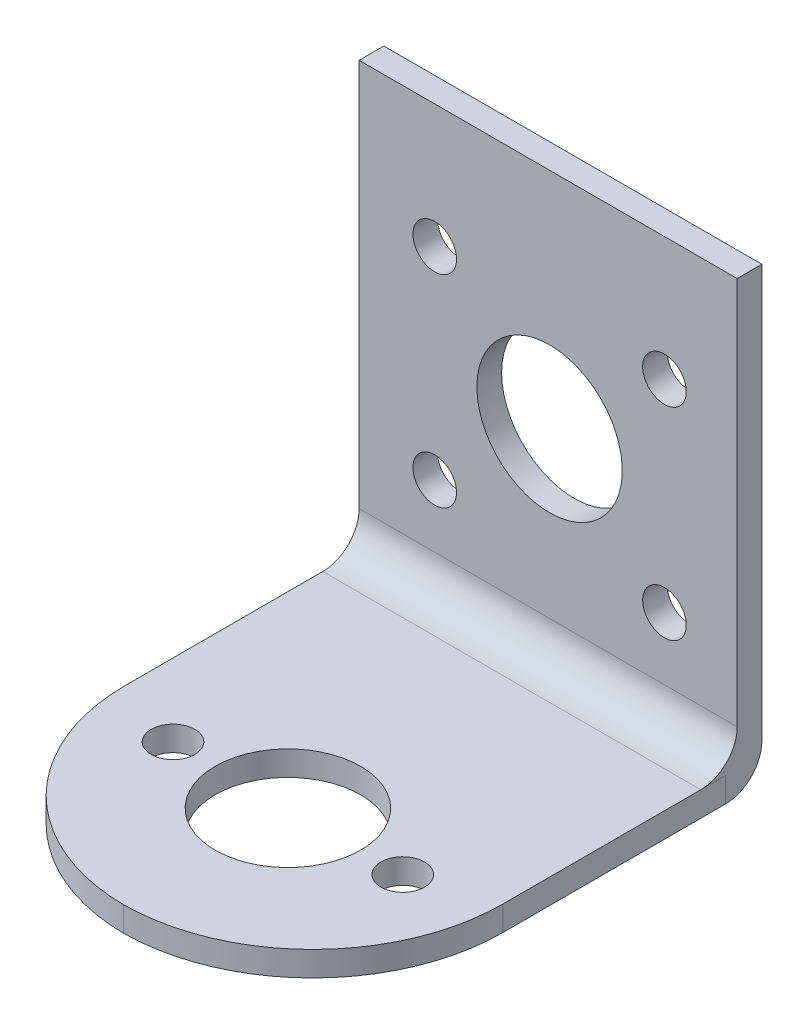
ISO-10303-21;
HEADER;
FILE_DESCRIPTION(('STEP AP214'),'2;1');
FILE_NAME('part.step','',(''),(''),'','','');
FILE_SCHEMA(('AUTOMOTIVE_DESIGN { 1 0 10303 214 1 1 1 1 }'));
ENDSEC;
DATA;
#1=APPLICATION_CONTEXT('core data for automotive mechanical design processes');
#2=APPLICATION_PROTOCOL_DEFINITION('international standard','automotive_design',2000,#1);
#3=PRODUCT_CONTEXT('',#1,'mechanical');
#4=PRODUCT('Part','Part','',(#3));
#5=PRODUCT_RELATED_PRODUCT_CATEGORY('part','',(#4));
#6=PRODUCT_DEFINITION_FORMATION('','',#4);
#7=PRODUCT_DEFINITION_CONTEXT('part definition',#1,'design');
#8=PRODUCT_DEFINITION('design','',#6,#7);
#9=PRODUCT_DEFINITION_SHAPE('','',#8);
#10=(LENGTH_UNIT() NAMED_UNIT(*) SI_UNIT(.MILLI.,.METRE.));
#11=(NAMED_UNIT(*) PLANE_ANGLE_UNIT() SI_UNIT($,.RADIAN.));
#12=(NAMED_UNIT(*) SI_UNIT($,.STERADIAN.) SOLID_ANGLE_UNIT());
#13=UNCERTAINTY_MEASURE_WITH_UNIT(LENGTH_MEASURE(1.E-05),#10,'distance_accuracy_value','');
#14=(GEOMETRIC_REPRESENTATION_CONTEXT(3) GLOBAL_UNCERTAINTY_ASSIGNED_CONTEXT((#13)) GLOBAL_UNIT_ASSIGNED_CONTEXT((#10,
#11,#12)) REPRESENTATION_CONTEXT('',''));
#15=CARTESIAN_POINT('',(0.,0.,0.));
#16=DIRECTION('',(0.,0.,1.));
#17=DIRECTION('',(1.,0.,0.));
#18=AXIS2_PLACEMENT_3D('',#15,#16,#17);
#19=CARTESIAN_POINT('',(0.,0.,0.));
#20=DIRECTION('',(0.,0.,1.));
#21=DIRECTION('',(1.,0.,0.));
#22=AXIS2_PLACEMENT_3D('',#19,#20,#21);
#23=PLANE('',#22);
#24=CARTESIAN_POINT('',(8.,6.95,0.));
#25=DIRECTION('',(0.,0.,-1.));
#26=DIRECTION('',(1.,0.,0.));
#27=AXIS2_PLACEMENT_3D('',#24,#25,#26);
#28=CIRCLE('',#27,1.5);
#29=CARTESIAN_POINT('',(6.5,6.95,0.));
#30=VERTEX_POINT('',#29);
#31=EDGE_CURVE('E213',#30,#30,#28,.T.);
#32=ORIENTED_EDGE('',*,*,#31,.F.);
#33=EDGE_LOOP('',(#32));
#34=FACE_BOUND('',#33,.T.);
#35=CARTESIAN_POINT('',(-7.8,-6.95,0.));
#36=DIRECTION('',(0.,0.,-1.));
#37=DIRECTION('',(1.,0.,0.));
#38=AXIS2_PLACEMENT_3D('',#35,#36,#37);
#39=CIRCLE('',#38,1.5);
#40=CARTESIAN_POINT('',(-9.3,-6.95,0.));
#41=VERTEX_POINT('',#40);
#42=EDGE_CURVE('E179',#41,#41,#39,.T.);
#43=ORIENTED_EDGE('',*,*,#42,.F.);
#44=EDGE_LOOP('',(#43));
#45=FACE_BOUND('',#44,.T.);
#46=CARTESIAN_POINT('',(8.,-6.95,0.));
#47=DIRECTION('',(0.,0.,-1.));
#48=DIRECTION('',(1.,0.,0.));
#49=AXIS2_PLACEMENT_3D('',#46,#47,#48);
#50=CIRCLE('',#49,1.5);
#51=CARTESIAN_POINT('',(6.5,-6.95,0.));
#52=VERTEX_POINT('',#51);
#53=EDGE_CURVE('E185',#52,#52,#50,.T.);
#54=ORIENTED_EDGE('',*,*,#53,.F.);
#55=EDGE_LOOP('',(#54));
#56=FACE_BOUND('',#55,.T.);
#57=CARTESIAN_POINT('',(0.1,0.0500000000000012,0.));
#58=DIRECTION('',(0.,0.,-1.));
#59=DIRECTION('',(1.,0.,0.));
#60=AXIS2_PLACEMENT_3D('',#57,#58,#59);
#61=CIRCLE('',#60,5.);
#62=CARTESIAN_POINT('',(-4.9,0.0500000000000006,0.));
#63=VERTEX_POINT('',#62);
#64=EDGE_CURVE('E199',#63,#63,#61,.T.);
#65=ORIENTED_EDGE('',*,*,#64,.F.);
#66=EDGE_LOOP('',(#65));
#67=FACE_BOUND('',#66,.T.);
#68=CARTESIAN_POINT('',(-7.8,6.95,0.));
#69=DIRECTION('',(0.,0.,-1.));
#70=DIRECTION('',(1.,0.,0.));
#71=AXIS2_PLACEMENT_3D('',#68,#69,#70);
#72=CIRCLE('',#71,1.5);
#73=CARTESIAN_POINT('',(-9.3,6.95,0.));
#74=VERTEX_POINT('',#73);
#75=EDGE_CURVE('E27',#74,#74,#72,.T.);
#76=ORIENTED_EDGE('',*,*,#75,.F.);
#77=EDGE_LOOP('',(#76));
#78=FACE_BOUND('',#77,.T.);
#79=DIRECTION('',(1.,0.,0.));
#80=VECTOR('',#79,1.);
#81=CARTESIAN_POINT('',(-6.5,-12.95,0.));
#82=LINE('',#81,#80);
#83=CARTESIAN_POINT('',(-13.,-12.95,0.));
#84=VERTEX_POINT('',#83);
#85=CARTESIAN_POINT('',(13.,-12.95,0.));
#86=VERTEX_POINT('',#85);
#87=EDGE_CURVE('E243',#84,#86,#82,.T.);
#88=ORIENTED_EDGE('',*,*,#87,.F.);
#89=DIRECTION('',(0.,1.,0.));
#90=VECTOR('',#89,1.);
#91=CARTESIAN_POINT('',(-13.,-15.45,0.));
#92=LINE('',#91,#90);
#93=CARTESIAN_POINT('',(-13.,15.45,0.));
#94=VERTEX_POINT('',#93);
#95=EDGE_CURVE('E336',#84,#94,#92,.T.);
#96=ORIENTED_EDGE('',*,*,#95,.T.);
#97=DIRECTION('',(1.,0.,0.));
#98=VECTOR('',#97,1.);
#99=CARTESIAN_POINT('',(-13.,15.45,0.));
#100=LINE('',#99,#98);
#101=CARTESIAN_POINT('',(13.,15.45,0.));
#102=VERTEX_POINT('',#101);
#103=EDGE_CURVE('E11',#94,#102,#100,.T.);
#104=ORIENTED_EDGE('',*,*,#103,.T.);
#105=DIRECTION('',(0.,-1.,0.));
#106=VECTOR('',#105,1.);
#107=CARTESIAN_POINT('',(13.,15.45,0.));
#108=LINE('',#107,#106);
#109=EDGE_CURVE('E269',#102,#86,#108,.T.);
#110=ORIENTED_EDGE('',*,*,#109,.T.);
#111=EDGE_LOOP('',(#88,#96,#104,#110));
#112=FACE_BOUND('',#111,.T.);
#113=ADVANCED_FACE('F16',(#34,#45,#56,#67,#78,#112),#23,.F.);
#114=CARTESIAN_POINT('',(13.,15.45,0.));
#115=DIRECTION('',(0.,1.,0.));
#116=DIRECTION('',(1.,0.,0.));
#117=AXIS2_PLACEMENT_3D('',#114,#115,#116);
#118=PLANE('',#117);
#119=DIRECTION('',(1.,0.,0.));
#120=VECTOR('',#119,1.);
#121=CARTESIAN_POINT('',(6.5,15.45,1.7));
#122=LINE('',#121,#120);
#123=CARTESIAN_POINT('',(-13.,15.45,1.7));
#124=VERTEX_POINT('',#123);
#125=CARTESIAN_POINT('',(13.,15.45,1.7));
#126=VERTEX_POINT('',#125);
#127=EDGE_CURVE('E275',#124,#126,#122,.T.);
#128=ORIENTED_EDGE('',*,*,#127,.T.);
#129=DIRECTION('',(0.,0.,1.));
#130=VECTOR('',#129,1.);
#131=CARTESIAN_POINT('',(13.,15.45,0.));
#132=LINE('',#131,#130);
#133=EDGE_CURVE('E282',#102,#126,#132,.T.);
#134=ORIENTED_EDGE('',*,*,#133,.F.);
#135=ORIENTED_EDGE('',*,*,#103,.F.);
#136=DIRECTION('',(0.,0.,1.));
#137=VECTOR('',#136,1.);
#138=CARTESIAN_POINT('',(-13.,15.45,0.));
#139=LINE('',#138,#137);
#140=EDGE_CURVE('E328',#94,#124,#139,.T.);
#141=ORIENTED_EDGE('',*,*,#140,.T.);
#142=EDGE_LOOP('',(#128,#134,#135,#141));
#143=FACE_BOUND('',#142,.T.);
#144=ADVANCED_FACE('F425',(#143),#118,.T.);
#145=CARTESIAN_POINT('',(-7.8,6.95,0.));
#146=DIRECTION('',(0.,0.,1.));
#147=DIRECTION('',(1.,0.,0.));
#148=AXIS2_PLACEMENT_3D('',#145,#146,#147);
#149=CYLINDRICAL_SURFACE('',#148,1.5);
#150=CARTESIAN_POINT('',(-7.8,6.95,1.7));
#151=DIRECTION('',(0.,0.,1.));
#152=DIRECTION('',(1.,0.,0.));
#153=AXIS2_PLACEMENT_3D('',#150,#151,#152);
#154=CIRCLE('',#153,1.5);
#155=CARTESIAN_POINT('',(-9.3,6.95,1.7));
#156=VERTEX_POINT('',#155);
#157=EDGE_CURVE('E249',#156,#156,#154,.T.);
#158=ORIENTED_EDGE('',*,*,#157,.T.);
#159=DIRECTION('',(0.,0.,-1.));
#160=VECTOR('',#159,1.);
#161=CARTESIAN_POINT('',(-9.3,6.95,0.));
#162=LINE('',#161,#160);
#163=EDGE_CURVE('E289',#156,#74,#162,.T.);
#164=ORIENTED_EDGE('',*,*,#163,.T.);
#165=ORIENTED_EDGE('',*,*,#75,.T.);
#166=ORIENTED_EDGE('',*,*,#163,.F.);
#167=EDGE_LOOP('',(#158,#164,#165,#166));
#168=FACE_BOUND('',#167,.T.);
#169=ADVANCED_FACE('F450',(#168),#149,.F.);
#170=CARTESIAN_POINT('',(0.1,0.0500000000000012,0.));
#171=DIRECTION('',(0.,0.,1.));
#172=DIRECTION('',(1.,0.,0.));
#173=AXIS2_PLACEMENT_3D('',#170,#171,#172);
#174=CYLINDRICAL_SURFACE('',#173,5.);
#175=CARTESIAN_POINT('',(0.1,0.0500000000000012,1.7));
#176=DIRECTION('',(0.,0.,1.));
#177=DIRECTION('',(1.,0.,0.));
#178=AXIS2_PLACEMENT_3D('',#175,#176,#177);
#179=CIRCLE('',#178,5.);
#180=CARTESIAN_POINT('',(-4.9,0.0500000000000012,1.7));
#181=VERTEX_POINT('',#180);
#182=EDGE_CURVE('E253',#181,#181,#179,.T.);
#183=ORIENTED_EDGE('',*,*,#182,.T.);
#184=DIRECTION('',(0.,0.,-1.));
#185=VECTOR('',#184,1.);
#186=CARTESIAN_POINT('',(-4.9,0.0500000000000006,0.));
#187=LINE('',#186,#185);
#188=EDGE_CURVE('E191',#181,#63,#187,.T.);
#189=ORIENTED_EDGE('',*,*,#188,.T.);
#190=ORIENTED_EDGE('',*,*,#64,.T.);
#191=ORIENTED_EDGE('',*,*,#188,.F.);
#192=EDGE_LOOP('',(#183,#189,#190,#191));
#193=FACE_BOUND('',#192,.T.);
#194=ADVANCED_FACE('F473',(#193),#174,.F.);
#195=CARTESIAN_POINT('',(8.,-6.95,0.));
#196=DIRECTION('',(0.,0.,1.));
#197=DIRECTION('',(1.,0.,0.));
#198=AXIS2_PLACEMENT_3D('',#195,#196,#197);
#199=CYLINDRICAL_SURFACE('',#198,1.5);
#200=CARTESIAN_POINT('',(8.,-6.95,1.7));
#201=DIRECTION('',(0.,0.,1.));
#202=DIRECTION('',(1.,0.,0.));
#203=AXIS2_PLACEMENT_3D('',#200,#201,#202);
#204=CIRCLE('',#203,1.5);
#205=CARTESIAN_POINT('',(6.5,-6.95,1.7));
#206=VERTEX_POINT('',#205);
#207=EDGE_CURVE('E210',#206,#206,#204,.T.);
#208=ORIENTED_EDGE('',*,*,#207,.T.);
#209=DIRECTION('',(0.,0.,-1.));
#210=VECTOR('',#209,1.);
#211=CARTESIAN_POINT('',(6.5,-6.95,0.));
#212=LINE('',#211,#210);
#213=EDGE_CURVE('E188',#206,#52,#212,.T.);
#214=ORIENTED_EDGE('',*,*,#213,.T.);
#215=ORIENTED_EDGE('',*,*,#53,.T.);
#216=ORIENTED_EDGE('',*,*,#213,.F.);
#217=EDGE_LOOP('',(#208,#214,#215,#216));
#218=FACE_BOUND('',#217,.T.);
#219=ADVANCED_FACE('F187',(#218),#199,.F.);
#220=CARTESIAN_POINT('',(-7.8,-6.95,0.));
#221=DIRECTION('',(0.,0.,1.));
#222=DIRECTION('',(1.,0.,0.));
#223=AXIS2_PLACEMENT_3D('',#220,#221,#222);
#224=CYLINDRICAL_SURFACE('',#223,1.5);
#225=CARTESIAN_POINT('',(-7.8,-6.95,1.7));
#226=DIRECTION('',(0.,0.,1.));
#227=DIRECTION('',(1.,0.,0.));
#228=AXIS2_PLACEMENT_3D('',#225,#226,#227);
#229=CIRCLE('',#228,1.5);
#230=CARTESIAN_POINT('',(-9.3,-6.95,1.7));
#231=VERTEX_POINT('',#230);
#232=EDGE_CURVE('E206',#231,#231,#229,.T.);
#233=ORIENTED_EDGE('',*,*,#232,.T.);
#234=DIRECTION('',(0.,0.,-1.));
#235=VECTOR('',#234,1.);
#236=CARTESIAN_POINT('',(-9.3,-6.95,0.));
#237=LINE('',#236,#235);
#238=EDGE_CURVE('E211',#231,#41,#237,.T.);
#239=ORIENTED_EDGE('',*,*,#238,.T.);
#240=ORIENTED_EDGE('',*,*,#42,.T.);
#241=ORIENTED_EDGE('',*,*,#238,.F.);
#242=EDGE_LOOP('',(#233,#239,#240,#241));
#243=FACE_BOUND('',#242,.T.);
#244=ADVANCED_FACE('F441',(#243),#224,.F.);
#245=CARTESIAN_POINT('',(8.,6.95,0.));
#246=DIRECTION('',(0.,0.,1.));
#247=DIRECTION('',(1.,0.,0.));
#248=AXIS2_PLACEMENT_3D('',#245,#246,#247);
#249=CYLINDRICAL_SURFACE('',#248,1.5);
#250=CARTESIAN_POINT('',(8.,6.95,1.7));
#251=DIRECTION('',(0.,0.,1.));
#252=DIRECTION('',(1.,0.,0.));
#253=AXIS2_PLACEMENT_3D('',#250,#251,#252);
#254=CIRCLE('',#253,1.5);
#255=CARTESIAN_POINT('',(6.5,6.95,1.7));
#256=VERTEX_POINT('',#255);
#257=EDGE_CURVE('E20',#256,#256,#254,.T.);
#258=ORIENTED_EDGE('',*,*,#257,.T.);
#259=DIRECTION('',(0.,0.,-1.));
#260=VECTOR('',#259,1.);
#261=CARTESIAN_POINT('',(6.5,6.95,0.));
#262=LINE('',#261,#260);
#263=EDGE_CURVE('E247',#256,#30,#262,.T.);
#264=ORIENTED_EDGE('',*,*,#263,.T.);
#265=ORIENTED_EDGE('',*,*,#31,.T.);
#266=ORIENTED_EDGE('',*,*,#263,.F.);
#267=EDGE_LOOP('',(#258,#264,#265,#266));
#268=FACE_BOUND('',#267,.T.);
#269=ADVANCED_FACE('F431',(#268),#249,.F.);
#270=CARTESIAN_POINT('',(1.11301214010219E-07,-13.75,16.69980915795));
#271=DIRECTION('',(0.,1.,0.));
#272=DIRECTION('',(1.,0.,0.));
#273=AXIS2_PLACEMENT_3D('',#270,#271,#272);
#274=PLANE('',#273);
#275=CARTESIAN_POINT('',(-7.99999980628491,-13.75,19.5));
#276=DIRECTION('',(0.,-1.,0.));
#277=DIRECTION('',(1.,0.,0.));
#278=AXIS2_PLACEMENT_3D('',#275,#276,#277);
#279=CIRCLE('',#278,1.5);
#280=CARTESIAN_POINT('',(-9.49999980628491,-13.75,19.5));
#281=VERTEX_POINT('',#280);
#282=EDGE_CURVE('E263',#281,#281,#279,.T.);
#283=ORIENTED_EDGE('',*,*,#282,.T.);
#284=EDGE_LOOP('',(#283));
#285=FACE_BOUND('',#284,.T.);
#286=CARTESIAN_POINT('',(-0.0999998062849059,-13.75,19.5));
#287=DIRECTION('',(0.,-1.,0.));
#288=DIRECTION('',(1.,0.,0.));
#289=AXIS2_PLACEMENT_3D('',#286,#287,#288);
#290=CIRCLE('',#289,5.);
#291=CARTESIAN_POINT('',(-5.09999980628491,-13.75,19.5));
#292=VERTEX_POINT('',#291);
#293=EDGE_CURVE('E262',#292,#292,#290,.T.);
#294=ORIENTED_EDGE('',*,*,#293,.T.);
#295=EDGE_LOOP('',(#294));
#296=FACE_BOUND('',#295,.T.);
#297=CARTESIAN_POINT('',(7.80000019371509,-13.75,19.5));
#298=DIRECTION('',(0.,-1.,0.));
#299=DIRECTION('',(1.,0.,0.));
#300=AXIS2_PLACEMENT_3D('',#297,#298,#299);
#301=CIRCLE('',#300,1.5);
#302=CARTESIAN_POINT('',(6.3000001937151,-13.75,19.5));
#303=VERTEX_POINT('',#302);
#304=EDGE_CURVE('E317',#303,#303,#301,.T.);
#305=ORIENTED_EDGE('',*,*,#304,.T.);
#306=EDGE_LOOP('',(#305));
#307=FACE_BOUND('',#306,.T.);
#308=DIRECTION('',(1.,0.,0.));
#309=VECTOR('',#308,1.);
#310=CARTESIAN_POINT('',(5.56506075922468E-08,-13.75,4.2));
#311=LINE('',#310,#309);
#312=CARTESIAN_POINT('',(-13.,-13.75,4.2));
#313=VERTEX_POINT('',#312);
#314=CARTESIAN_POINT('',(13.0000000417233,-13.75,4.2));
#315=VERTEX_POINT('',#314);
#316=EDGE_CURVE('E271',#313,#315,#311,.T.);
#317=ORIENTED_EDGE('',*,*,#316,.F.);
#318=DIRECTION('',(0.,0.,-1.));
#319=VECTOR('',#318,1.);
#320=CARTESIAN_POINT('',(-13.,-13.75,1.25));
#321=LINE('',#320,#319);
#322=CARTESIAN_POINT('',(-13.,-13.75,17.8));
#323=VERTEX_POINT('',#322);
#324=EDGE_CURVE('E326',#323,#313,#321,.T.);
#325=ORIENTED_EDGE('',*,*,#324,.F.);
#326=CARTESIAN_POINT('',(0.1,-13.75,17.8));
#327=DIRECTION('',(0.,1.,0.));
#328=DIRECTION('',(-1.,0.,0.));
#329=AXIS2_PLACEMENT_3D('',#326,#327,#328);
#330=CIRCLE('',#329,13.1);
#331=CARTESIAN_POINT('',(1.11301275973474E-07,-13.75,30.8996183158999));
#332=VERTEX_POINT('',#331);
#333=EDGE_CURVE('E283',#323,#332,#330,.T.);
#334=ORIENTED_EDGE('',*,*,#333,.T.);
#335=CARTESIAN_POINT('',(-0.0999997773975889,-13.75,17.8));
#336=DIRECTION('',(0.,1.,0.));
#337=DIRECTION('',(0.,0.,1.));
#338=AXIS2_PLACEMENT_3D('',#335,#336,#337);
#339=CIRCLE('',#338,13.1);
#340=CARTESIAN_POINT('',(13.0000002226024,-13.75,17.8000002226024));
#341=VERTEX_POINT('',#340);
#342=EDGE_CURVE('E258',#332,#341,#339,.T.);
#343=ORIENTED_EDGE('',*,*,#342,.T.);
#344=DIRECTION('',(-9.93410721205324E-09,0.,-1.));
#345=VECTOR('',#344,1.);
#346=CARTESIAN_POINT('',(13.0000001937151,-13.75,19.5));
#347=LINE('',#346,#345);
#348=EDGE_CURVE('E259',#341,#315,#347,.T.);
#349=ORIENTED_EDGE('',*,*,#348,.T.);
#350=EDGE_LOOP('',(#317,#325,#334,#343,#349));
#351=FACE_BOUND('',#350,.T.);
#352=ADVANCED_FACE('F18',(#285,#296,#307,#351),#274,.T.);
#353=CARTESIAN_POINT('',(0.1,-15.45,17.8));
#354=DIRECTION('',(0.,1.,0.));
#355=DIRECTION('',(-1.,0.,0.));
#356=AXIS2_PLACEMENT_3D('',#353,#354,#355);
#357=CYLINDRICAL_SURFACE('',#356,13.1);
#358=CARTESIAN_POINT('',(0.1,-15.45,17.8));
#359=DIRECTION('',(0.,1.,0.));
#360=DIRECTION('',(-1.,0.,0.));
#361=AXIS2_PLACEMENT_3D('',#358,#359,#360);
#362=CIRCLE('',#361,13.1);
#363=CARTESIAN_POINT('',(-13.,-15.45,17.8));
#364=VERTEX_POINT('',#363);
#365=CARTESIAN_POINT('',(1.11301275488819E-07,-15.45,30.8996183158999));
#366=VERTEX_POINT('',#365);
#367=EDGE_CURVE('E215',#364,#366,#362,.T.);
#368=ORIENTED_EDGE('',*,*,#367,.T.);
#369=DIRECTION('',(0.,1.,0.));
#370=VECTOR('',#369,1.);
#371=CARTESIAN_POINT('',(1.11301275488819E-07,-15.45,30.8996183158999));
#372=LINE('',#371,#370);
#373=EDGE_CURVE('E286',#366,#332,#372,.T.);
#374=ORIENTED_EDGE('',*,*,#373,.T.);
#375=ORIENTED_EDGE('',*,*,#333,.F.);
#376=DIRECTION('',(0.,1.,0.));
#377=VECTOR('',#376,1.);
#378=CARTESIAN_POINT('',(-13.,-15.45,17.8));
#379=LINE('',#378,#377);
#380=EDGE_CURVE('E204',#364,#323,#379,.T.);
#381=ORIENTED_EDGE('',*,*,#380,.F.);
#382=EDGE_LOOP('',(#368,#374,#375,#381));
#383=FACE_BOUND('',#382,.T.);
#384=ADVANCED_FACE('F430',(#383),#357,.T.);
#385=CARTESIAN_POINT('',(-0.0999997773975889,-15.45,17.8));
#386=DIRECTION('',(0.,1.,0.));
#387=DIRECTION('',(0.,0.,1.));
#388=AXIS2_PLACEMENT_3D('',#385,#386,#387);
#389=CYLINDRICAL_SURFACE('',#388,13.1);
#390=CARTESIAN_POINT('',(-0.0999997773975889,-15.45,17.8));
#391=DIRECTION('',(0.,1.,0.));
#392=DIRECTION('',(0.,0.,1.));
#393=AXIS2_PLACEMENT_3D('',#390,#391,#392);
#394=CIRCLE('',#393,13.1);
#395=CARTESIAN_POINT('',(13.0000002226024,-15.45,17.8000002226024));
#396=VERTEX_POINT('',#395);
#397=EDGE_CURVE('E219',#366,#396,#394,.T.);
#398=ORIENTED_EDGE('',*,*,#397,.T.);
#399=DIRECTION('',(0.,1.,0.));
#400=VECTOR('',#399,1.);
#401=CARTESIAN_POINT('',(13.0000002226024,-15.45,17.8000002226024));
#402=LINE('',#401,#400);
#403=EDGE_CURVE('E254',#396,#341,#402,.T.);
#404=ORIENTED_EDGE('',*,*,#403,.T.);
#405=ORIENTED_EDGE('',*,*,#342,.F.);
#406=ORIENTED_EDGE('',*,*,#373,.F.);
#407=EDGE_LOOP('',(#398,#404,#405,#406));
#408=FACE_BOUND('',#407,.T.);
#409=ADVANCED_FACE('F438',(#408),#389,.T.);
#410=CARTESIAN_POINT('',(13.0000001768271,-15.45,17.8000002226024));
#411=DIRECTION('',(1.,0.,-9.93410721205324E-09));
#412=DIRECTION('',(0.,-1.,0.));
#413=AXIS2_PLACEMENT_3D('',#410,#411,#412);
#414=PLANE('',#413);
#415=DIRECTION('',(-9.93410721205324E-09,0.,-1.));
#416=VECTOR('',#415,1.);
#417=CARTESIAN_POINT('',(13.0000001937151,-15.45,19.5));
#418=LINE('',#417,#416);
#419=CARTESIAN_POINT('',(13.,-15.45,2.5));
#420=VERTEX_POINT('',#419);
#421=EDGE_CURVE('E220',#396,#420,#418,.T.);
#422=ORIENTED_EDGE('',*,*,#421,.T.);
#423=DIRECTION('',(0.,1.,0.));
#424=VECTOR('',#423,1.);
#425=CARTESIAN_POINT('',(13.,15.45,2.5));
#426=LINE('',#425,#424);
#427=CARTESIAN_POINT('',(13.,-13.75,2.5));
#428=VERTEX_POINT('',#427);
#429=EDGE_CURVE('E310',#420,#428,#426,.T.);
#430=ORIENTED_EDGE('',*,*,#429,.T.);
#431=DIRECTION('',(-9.93410721205324E-09,0.,-1.));
#432=VECTOR('',#431,1.);
#433=CARTESIAN_POINT('',(13.0000001937151,-13.75,19.5));
#434=LINE('',#433,#432);
#435=EDGE_CURVE('E312',#315,#428,#434,.T.);
#436=ORIENTED_EDGE('',*,*,#435,.F.);
#437=ORIENTED_EDGE('',*,*,#348,.F.);
#438=ORIENTED_EDGE('',*,*,#403,.F.);
#439=EDGE_LOOP('',(#422,#430,#436,#437,#438));
#440=FACE_BOUND('',#439,.T.);
#441=ADVANCED_FACE('F409',(#440),#414,.T.);
#442=CARTESIAN_POINT('',(7.80000019371509,-15.45,19.5));
#443=DIRECTION('',(0.,1.,0.));
#444=DIRECTION('',(1.,0.,0.));
#445=AXIS2_PLACEMENT_3D('',#442,#443,#444);
#446=CYLINDRICAL_SURFACE('',#445,1.5);
#447=ORIENTED_EDGE('',*,*,#304,.F.);
#448=DIRECTION('',(0.,-1.,0.));
#449=VECTOR('',#448,1.);
#450=CARTESIAN_POINT('',(6.3000001937151,-15.45,19.5));
#451=LINE('',#450,#449);
#452=CARTESIAN_POINT('',(6.3000001937151,-15.45,19.5));
#453=VERTEX_POINT('',#452);
#454=EDGE_CURVE('E129',#303,#453,#451,.T.);
#455=ORIENTED_EDGE('',*,*,#454,.T.);
#456=CARTESIAN_POINT('',(7.80000019371509,-15.45,19.5));
#457=DIRECTION('',(0.,-1.,0.));
#458=DIRECTION('',(1.,0.,0.));
#459=AXIS2_PLACEMENT_3D('',#456,#457,#458);
#460=CIRCLE('',#459,1.5);
#461=EDGE_CURVE('E294',#453,#453,#460,.T.);
#462=ORIENTED_EDGE('',*,*,#461,.T.);
#463=ORIENTED_EDGE('',*,*,#454,.F.);
#464=EDGE_LOOP('',(#447,#455,#462,#463));
#465=FACE_BOUND('',#464,.T.);
#466=ADVANCED_FACE('F459',(#465),#446,.F.);
#467=CARTESIAN_POINT('',(-0.0999998062849059,-15.45,19.5));
#468=DIRECTION('',(0.,1.,0.));
#469=DIRECTION('',(1.,0.,0.));
#470=AXIS2_PLACEMENT_3D('',#467,#468,#469);
#471=CYLINDRICAL_SURFACE('',#470,5.);
#472=ORIENTED_EDGE('',*,*,#293,.F.);
#473=DIRECTION('',(0.,-1.,0.));
#474=VECTOR('',#473,1.);
#475=CARTESIAN_POINT('',(-5.09999980628491,-15.45,19.5));
#476=LINE('',#475,#474);
#477=CARTESIAN_POINT('',(-5.09999980628491,-15.45,19.5));
#478=VERTEX_POINT('',#477);
#479=EDGE_CURVE('E143',#292,#478,#476,.T.);
#480=ORIENTED_EDGE('',*,*,#479,.T.);
#481=CARTESIAN_POINT('',(-0.0999998062849059,-15.45,19.5));
#482=DIRECTION('',(0.,-1.,0.));
#483=DIRECTION('',(1.,0.,0.));
#484=AXIS2_PLACEMENT_3D('',#481,#482,#483);
#485=CIRCLE('',#484,5.);
#486=EDGE_CURVE('E270',#478,#478,#485,.T.);
#487=ORIENTED_EDGE('',*,*,#486,.T.);
#488=ORIENTED_EDGE('',*,*,#479,.F.);
#489=EDGE_LOOP('',(#472,#480,#487,#488));
#490=FACE_BOUND('',#489,.T.);
#491=ADVANCED_FACE('F395',(#490),#471,.F.);
#492=CARTESIAN_POINT('',(-7.99999980628491,-15.45,19.5));
#493=DIRECTION('',(0.,1.,0.));
#494=DIRECTION('',(1.,0.,0.));
#495=AXIS2_PLACEMENT_3D('',#492,#493,#494);
#496=CYLINDRICAL_SURFACE('',#495,1.5);
#497=ORIENTED_EDGE('',*,*,#282,.F.);
#498=DIRECTION('',(0.,-1.,0.));
#499=VECTOR('',#498,1.);
#500=CARTESIAN_POINT('',(-9.49999980628491,-15.45,19.5));
#501=LINE('',#500,#499);
#502=CARTESIAN_POINT('',(-9.49999980628491,-15.45,19.5));
#503=VERTEX_POINT('',#502);
#504=EDGE_CURVE('E260',#281,#503,#501,.T.);
#505=ORIENTED_EDGE('',*,*,#504,.T.);
#506=CARTESIAN_POINT('',(-7.99999980628491,-15.45,19.5));
#507=DIRECTION('',(0.,-1.,0.));
#508=DIRECTION('',(1.,0.,0.));
#509=AXIS2_PLACEMENT_3D('',#506,#507,#508);
#510=CIRCLE('',#509,1.5);
#511=EDGE_CURVE('E265',#503,#503,#510,.T.);
#512=ORIENTED_EDGE('',*,*,#511,.T.);
#513=ORIENTED_EDGE('',*,*,#504,.F.);
#514=EDGE_LOOP('',(#497,#505,#512,#513));
#515=FACE_BOUND('',#514,.T.);
#516=ADVANCED_FACE('F462',(#515),#496,.F.);
#517=CARTESIAN_POINT('',(-13.,15.45,0.));
#518=DIRECTION('',(-1.,0.,0.));
#519=DIRECTION('',(0.,0.,1.));
#520=AXIS2_PLACEMENT_3D('',#517,#518,#519);
#521=PLANE('',#520);
#522=CARTESIAN_POINT('',(-13.,-12.95,2.5));
#523=DIRECTION('',(1.,0.,0.));
#524=DIRECTION('',(0.,-0.707106781186548,-0.707106781186548));
#525=AXIS2_PLACEMENT_3D('',#522,#523,#524);
#526=CIRCLE('',#525,2.5);
#527=CARTESIAN_POINT('',(-13.,-15.45,2.5));
#528=VERTEX_POINT('',#527);
#529=EDGE_CURVE('E295',#528,#84,#526,.T.);
#530=ORIENTED_EDGE('',*,*,#529,.F.);
#531=DIRECTION('',(0.,0.,1.));
#532=VECTOR('',#531,1.);
#533=CARTESIAN_POINT('',(-13.,-15.45,0.));
#534=LINE('',#533,#532);
#535=EDGE_CURVE('E218',#528,#364,#534,.T.);
#536=ORIENTED_EDGE('',*,*,#535,.T.);
#537=ORIENTED_EDGE('',*,*,#380,.T.);
#538=ORIENTED_EDGE('',*,*,#324,.T.);
#539=CARTESIAN_POINT('',(-13.,-11.25,4.2));
#540=DIRECTION('',(-1.,0.,0.));
#541=DIRECTION('',(0.,-0.707106781186548,-0.707106781186548));
#542=AXIS2_PLACEMENT_3D('',#539,#540,#541);
#543=CIRCLE('',#542,2.5);
#544=CARTESIAN_POINT('',(-13.,-11.25,1.7));
#545=VERTEX_POINT('',#544);
#546=EDGE_CURVE('E276',#545,#313,#543,.T.);
#547=ORIENTED_EDGE('',*,*,#546,.F.);
#548=DIRECTION('',(0.,1.,0.));
#549=VECTOR('',#548,1.);
#550=CARTESIAN_POINT('',(-13.,7.725,1.7));
#551=LINE('',#550,#549);
#552=EDGE_CURVE('E330',#545,#124,#551,.T.);
#553=ORIENTED_EDGE('',*,*,#552,.T.);
#554=ORIENTED_EDGE('',*,*,#140,.F.);
#555=ORIENTED_EDGE('',*,*,#95,.F.);
#556=EDGE_LOOP('',(#530,#536,#537,#538,#547,#553,#554,#555));
#557=FACE_BOUND('',#556,.T.);
#558=ADVANCED_FACE('F363',(#557),#521,.T.);
#559=CARTESIAN_POINT('',(0.,0.,1.7));
#560=DIRECTION('',(0.,0.,1.));
#561=DIRECTION('',(1.,0.,0.));
#562=AXIS2_PLACEMENT_3D('',#559,#560,#561);
#563=PLANE('',#562);
#564=ORIENTED_EDGE('',*,*,#157,.F.);
#565=EDGE_LOOP('',(#564));
#566=FACE_BOUND('',#565,.T.);
#567=ORIENTED_EDGE('',*,*,#182,.F.);
#568=EDGE_LOOP('',(#567));
#569=FACE_BOUND('',#568,.T.);
#570=ORIENTED_EDGE('',*,*,#207,.F.);
#571=EDGE_LOOP('',(#570));
#572=FACE_BOUND('',#571,.T.);
#573=ORIENTED_EDGE('',*,*,#232,.F.);
#574=EDGE_LOOP('',(#573));
#575=FACE_BOUND('',#574,.T.);
#576=ORIENTED_EDGE('',*,*,#257,.F.);
#577=EDGE_LOOP('',(#576));
#578=FACE_BOUND('',#577,.T.);
#579=DIRECTION('',(-1.,0.,0.));
#580=VECTOR('',#579,1.);
#581=CARTESIAN_POINT('',(5.56506073787424E-08,-11.25,1.7));
#582=LINE('',#581,#580);
#583=CARTESIAN_POINT('',(13.,-11.25,1.7));
#584=VERTEX_POINT('',#583);
#585=EDGE_CURVE('E306',#584,#545,#582,.T.);
#586=ORIENTED_EDGE('',*,*,#585,.F.);
#587=DIRECTION('',(0.,-1.,0.));
#588=VECTOR('',#587,1.);
#589=CARTESIAN_POINT('',(13.,-7.725,1.7));
#590=LINE('',#589,#588);
#591=EDGE_CURVE('E277',#126,#584,#590,.T.);
#592=ORIENTED_EDGE('',*,*,#591,.F.);
#593=ORIENTED_EDGE('',*,*,#127,.F.);
#594=ORIENTED_EDGE('',*,*,#552,.F.);
#595=EDGE_LOOP('',(#586,#592,#593,#594));
#596=FACE_BOUND('',#595,.T.);
#597=ADVANCED_FACE('F359',(#566,#569,#572,#575,#578,#596),#563,.T.);
#598=CARTESIAN_POINT('',(5.56506073787424E-08,-11.25,4.2));
#599=DIRECTION('',(-1.,0.,0.));
#600=DIRECTION('',(0.,-0.707106781186548,-0.707106781186548));
#601=AXIS2_PLACEMENT_3D('',#598,#599,#600);
#602=CYLINDRICAL_SURFACE('',#601,2.5);
#603=CARTESIAN_POINT('',(13.,-11.25,4.2));
#604=DIRECTION('',(1.,0.,0.));
#605=DIRECTION('',(0.,-0.707106781186548,-0.707106781186548));
#606=AXIS2_PLACEMENT_3D('',#603,#604,#605);
#607=CIRCLE('',#606,2.5);
#608=EDGE_CURVE('E281',#315,#584,#607,.T.);
#609=ORIENTED_EDGE('',*,*,#608,.T.);
#610=ORIENTED_EDGE('',*,*,#585,.T.);
#611=ORIENTED_EDGE('',*,*,#546,.T.);
#612=ORIENTED_EDGE('',*,*,#316,.T.);
#613=EDGE_LOOP('',(#609,#610,#611,#612));
#614=FACE_BOUND('',#613,.T.);
#615=ADVANCED_FACE('F362',(#614),#602,.F.);
#616=CARTESIAN_POINT('',(13.,-15.45,0.));
#617=DIRECTION('',(1.,0.,0.));
#618=DIRECTION('',(0.,1.,0.));
#619=AXIS2_PLACEMENT_3D('',#616,#617,#618);
#620=PLANE('',#619);
#621=CARTESIAN_POINT('',(13.,-12.95,2.5));
#622=DIRECTION('',(-1.,0.,0.));
#623=DIRECTION('',(0.,-0.707106781186548,-0.707106781186548));
#624=AXIS2_PLACEMENT_3D('',#621,#622,#623);
#625=CIRCLE('',#624,2.5);
#626=EDGE_CURVE('E234',#86,#420,#625,.T.);
#627=ORIENTED_EDGE('',*,*,#626,.F.);
#628=ORIENTED_EDGE('',*,*,#109,.F.);
#629=ORIENTED_EDGE('',*,*,#133,.T.);
#630=ORIENTED_EDGE('',*,*,#591,.T.);
#631=ORIENTED_EDGE('',*,*,#608,.F.);
#632=ORIENTED_EDGE('',*,*,#435,.T.);
#633=ORIENTED_EDGE('',*,*,#429,.F.);
#634=EDGE_LOOP('',(#627,#628,#629,#630,#631,#632,#633));
#635=FACE_BOUND('',#634,.T.);
#636=ADVANCED_FACE('F380',(#635),#620,.T.);
#637=CARTESIAN_POINT('',(-13.,-15.45,0.));
#638=DIRECTION('',(0.,-1.,0.));
#639=DIRECTION('',(0.,0.,-1.));
#640=AXIS2_PLACEMENT_3D('',#637,#638,#639);
#641=PLANE('',#640);
#642=ORIENTED_EDGE('',*,*,#511,.F.);
#643=EDGE_LOOP('',(#642));
#644=FACE_BOUND('',#643,.T.);
#645=ORIENTED_EDGE('',*,*,#486,.F.);
#646=EDGE_LOOP('',(#645));
#647=FACE_BOUND('',#646,.T.);
#648=ORIENTED_EDGE('',*,*,#461,.F.);
#649=EDGE_LOOP('',(#648));
#650=FACE_BOUND('',#649,.T.);
#651=DIRECTION('',(-1.,0.,0.));
#652=VECTOR('',#651,1.);
#653=CARTESIAN_POINT('',(-6.5,-15.45,2.5));
#654=LINE('',#653,#652);
#655=EDGE_CURVE('E223',#420,#528,#654,.T.);
#656=ORIENTED_EDGE('',*,*,#655,.F.);
#657=ORIENTED_EDGE('',*,*,#421,.F.);
#658=ORIENTED_EDGE('',*,*,#397,.F.);
#659=ORIENTED_EDGE('',*,*,#367,.F.);
#660=ORIENTED_EDGE('',*,*,#535,.F.);
#661=EDGE_LOOP('',(#656,#657,#658,#659,#660));
#662=FACE_BOUND('',#661,.T.);
#663=ADVANCED_FACE('F398',(#644,#647,#650,#662),#641,.T.);
#664=CARTESIAN_POINT('',(-6.5,-12.95,2.5));
#665=DIRECTION('',(-1.,0.,0.));
#666=DIRECTION('',(0.,-0.707106781186548,-0.707106781186548));
#667=AXIS2_PLACEMENT_3D('',#664,#665,#666);
#668=CYLINDRICAL_SURFACE('',#667,2.5);
#669=ORIENTED_EDGE('',*,*,#529,.T.);
#670=ORIENTED_EDGE('',*,*,#87,.T.);
#671=ORIENTED_EDGE('',*,*,#626,.T.);
#672=ORIENTED_EDGE('',*,*,#655,.T.);
#673=EDGE_LOOP('',(#669,#670,#671,#672));
#674=FACE_BOUND('',#673,.T.);
#675=ADVANCED_FACE('F401',(#674),#668,.T.);
#676=CLOSED_SHELL('',(#113,#144,#169,#194,#219,#244,#269,#352,#384,#409,#441,#466,#491,#516,
#558,#597,#615,#636,#663,#675));
#677=MANIFOLD_SOLID_BREP('B1',#676);
#678=ADVANCED_BREP_SHAPE_REPRESENTATION('',(#18,#677),#14);
#679=SHAPE_DEFINITION_REPRESENTATION(#9,#678);
ENDSEC;
END-ISO-10303-21;
